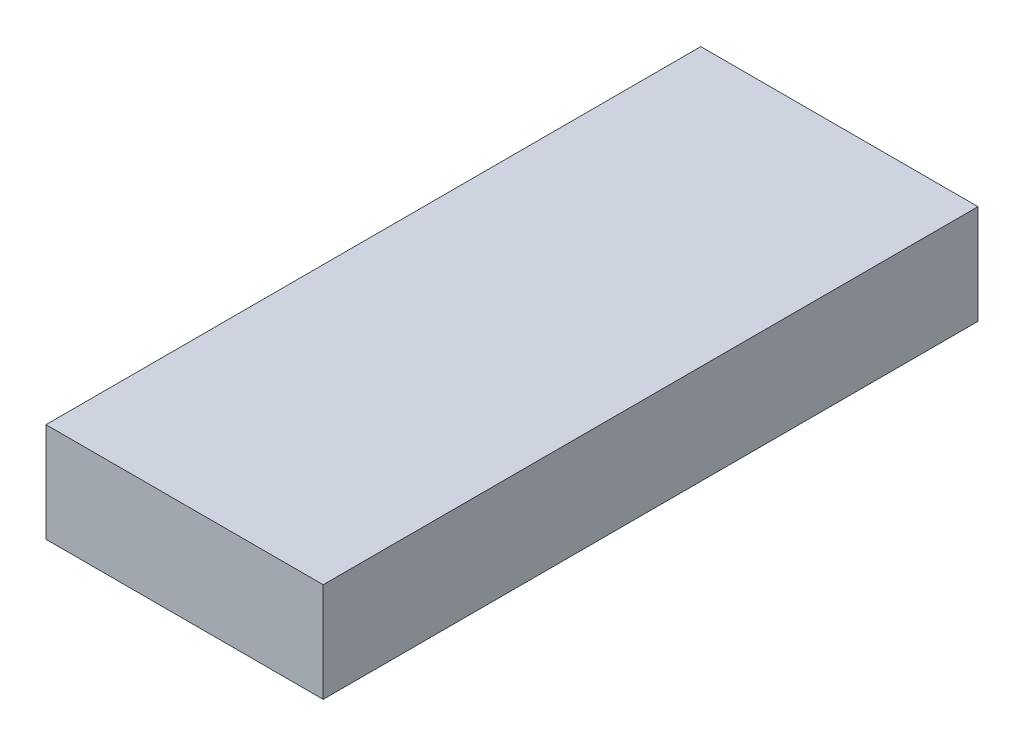
ISO-10303-21;
HEADER;
FILE_DESCRIPTION(('STEP AP214'),'2;1');
FILE_NAME('part.step','',(''),(''),'','','');
FILE_SCHEMA(('AUTOMOTIVE_DESIGN { 1 0 10303 214 1 1 1 1 }'));
ENDSEC;
DATA;
#1=APPLICATION_CONTEXT('core data for automotive mechanical design processes');
#2=APPLICATION_PROTOCOL_DEFINITION('international standard','automotive_design',2000,#1);
#3=PRODUCT_CONTEXT('',#1,'mechanical');
#4=PRODUCT('Part','Part','',(#3));
#5=PRODUCT_RELATED_PRODUCT_CATEGORY('part','',(#4));
#6=PRODUCT_DEFINITION_FORMATION('','',#4);
#7=PRODUCT_DEFINITION_CONTEXT('part definition',#1,'design');
#8=PRODUCT_DEFINITION('design','',#6,#7);
#9=PRODUCT_DEFINITION_SHAPE('','',#8);
#10=(LENGTH_UNIT() NAMED_UNIT(*) SI_UNIT(.MILLI.,.METRE.));
#11=(NAMED_UNIT(*) PLANE_ANGLE_UNIT() SI_UNIT($,.RADIAN.));
#12=(NAMED_UNIT(*) SI_UNIT($,.STERADIAN.) SOLID_ANGLE_UNIT());
#13=UNCERTAINTY_MEASURE_WITH_UNIT(LENGTH_MEASURE(1.E-05),#10,'distance_accuracy_value','');
#14=(GEOMETRIC_REPRESENTATION_CONTEXT(3) GLOBAL_UNCERTAINTY_ASSIGNED_CONTEXT((#13)) GLOBAL_UNIT_ASSIGNED_CONTEXT((#10,
#11,#12)) REPRESENTATION_CONTEXT('',''));
#15=CARTESIAN_POINT('',(0.,0.,0.));
#16=DIRECTION('',(0.,0.,1.));
#17=DIRECTION('',(1.,0.,0.));
#18=AXIS2_PLACEMENT_3D('',#15,#16,#17);
#19=CARTESIAN_POINT('',(0.508,-0.18199862,2.40000028));
#20=DIRECTION('',(0.,0.,-1.));
#21=DIRECTION('',(0.,-1.,0.));
#22=AXIS2_PLACEMENT_3D('',#19,#20,#21);
#23=PLANE('',#22);
#24=DIRECTION('',(0.,1.,0.));
#25=VECTOR('',#24,1.);
#26=CARTESIAN_POINT('',(0.508,-0.18199862,2.40000028));
#27=LINE('',#26,#25);
#28=CARTESIAN_POINT('',(0.508,-0.18199862,2.40000028));
#29=VERTEX_POINT('',#28);
#30=CARTESIAN_POINT('',(0.508,0.18200116,2.40000028));
#31=VERTEX_POINT('',#30);
#32=EDGE_CURVE('E89',#29,#31,#27,.T.);
#33=ORIENTED_EDGE('',*,*,#32,.T.);
#34=DIRECTION('',(-1.,0.,0.));
#35=VECTOR('',#34,1.);
#36=CARTESIAN_POINT('',(0.508,0.18200116,2.40000028));
#37=LINE('',#36,#35);
#38=CARTESIAN_POINT('',(-0.508,0.18200116,2.40000028));
#39=VERTEX_POINT('',#38);
#40=EDGE_CURVE('E84',#31,#39,#37,.T.);
#41=ORIENTED_EDGE('',*,*,#40,.T.);
#42=DIRECTION('',(0.,-1.,0.));
#43=VECTOR('',#42,1.);
#44=CARTESIAN_POINT('',(-0.508,0.18200116,2.40000028));
#45=LINE('',#44,#43);
#46=CARTESIAN_POINT('',(-0.508,-0.18199862,2.40000028));
#47=VERTEX_POINT('',#46);
#48=EDGE_CURVE('E100',#39,#47,#45,.T.);
#49=ORIENTED_EDGE('',*,*,#48,.T.);
#50=DIRECTION('',(1.,0.,0.));
#51=VECTOR('',#50,1.);
#52=CARTESIAN_POINT('',(-0.508,-0.18199862,2.40000028));
#53=LINE('',#52,#51);
#54=EDGE_CURVE('E11',#47,#29,#53,.T.);
#55=ORIENTED_EDGE('',*,*,#54,.T.);
#56=EDGE_LOOP('',(#33,#41,#49,#55));
#57=FACE_BOUND('',#56,.T.);
#58=ADVANCED_FACE('F16',(#57),#23,.F.);
#59=CARTESIAN_POINT('',(0.508,-0.18199862,0.));
#60=DIRECTION('',(0.,0.,-1.));
#61=DIRECTION('',(0.,-1.,0.));
#62=AXIS2_PLACEMENT_3D('',#59,#60,#61);
#63=PLANE('',#62);
#64=DIRECTION('',(1.,0.,0.));
#65=VECTOR('',#64,1.);
#66=CARTESIAN_POINT('',(-0.508,-0.18199862,0.));
#67=LINE('',#66,#65);
#68=CARTESIAN_POINT('',(-0.508,-0.18199862,0.));
#69=VERTEX_POINT('',#68);
#70=CARTESIAN_POINT('',(0.508,-0.18199862,0.));
#71=VERTEX_POINT('',#70);
#72=EDGE_CURVE('E20',#69,#71,#67,.T.);
#73=ORIENTED_EDGE('',*,*,#72,.F.);
#74=DIRECTION('',(0.,-1.,0.));
#75=VECTOR('',#74,1.);
#76=CARTESIAN_POINT('',(-0.508,0.18200116,0.));
#77=LINE('',#76,#75);
#78=CARTESIAN_POINT('',(-0.508,0.18200116,0.));
#79=VERTEX_POINT('',#78);
#80=EDGE_CURVE('E72',#79,#69,#77,.T.);
#81=ORIENTED_EDGE('',*,*,#80,.F.);
#82=DIRECTION('',(-1.,0.,0.));
#83=VECTOR('',#82,1.);
#84=CARTESIAN_POINT('',(0.508,0.18200116,0.));
#85=LINE('',#84,#83);
#86=CARTESIAN_POINT('',(0.508,0.18200116,0.));
#87=VERTEX_POINT('',#86);
#88=EDGE_CURVE('E66',#87,#79,#85,.T.);
#89=ORIENTED_EDGE('',*,*,#88,.F.);
#90=DIRECTION('',(0.,1.,0.));
#91=VECTOR('',#90,1.);
#92=CARTESIAN_POINT('',(0.508,-0.18199862,0.));
#93=LINE('',#92,#91);
#94=EDGE_CURVE('E70',#71,#87,#93,.T.);
#95=ORIENTED_EDGE('',*,*,#94,.F.);
#96=EDGE_LOOP('',(#73,#81,#89,#95));
#97=FACE_BOUND('',#96,.T.);
#98=ADVANCED_FACE('F68',(#97),#63,.T.);
#99=CARTESIAN_POINT('',(-0.508,-0.18199862,0.));
#100=DIRECTION('',(0.,1.,0.));
#101=DIRECTION('',(1.,0.,0.));
#102=AXIS2_PLACEMENT_3D('',#99,#100,#101);
#103=PLANE('',#102);
#104=ORIENTED_EDGE('',*,*,#72,.T.);
#105=DIRECTION('',(0.,0.,1.));
#106=VECTOR('',#105,1.);
#107=CARTESIAN_POINT('',(0.508,-0.18199862,0.));
#108=LINE('',#107,#106);
#109=EDGE_CURVE('E78',#71,#29,#108,.T.);
#110=ORIENTED_EDGE('',*,*,#109,.T.);
#111=ORIENTED_EDGE('',*,*,#54,.F.);
#112=DIRECTION('',(0.,0.,1.));
#113=VECTOR('',#112,1.);
#114=CARTESIAN_POINT('',(-0.508,-0.18199862,0.));
#115=LINE('',#114,#113);
#116=EDGE_CURVE('E109',#69,#47,#115,.T.);
#117=ORIENTED_EDGE('',*,*,#116,.F.);
#118=EDGE_LOOP('',(#104,#110,#111,#117));
#119=FACE_BOUND('',#118,.T.);
#120=ADVANCED_FACE('F115',(#119),#103,.F.);
#121=CARTESIAN_POINT('',(-0.508,0.18200116,0.));
#122=DIRECTION('',(1.,0.,0.));
#123=DIRECTION('',(0.,1.,0.));
#124=AXIS2_PLACEMENT_3D('',#121,#122,#123);
#125=PLANE('',#124);
#126=ORIENTED_EDGE('',*,*,#80,.T.);
#127=ORIENTED_EDGE('',*,*,#116,.T.);
#128=ORIENTED_EDGE('',*,*,#48,.F.);
#129=DIRECTION('',(0.,0.,1.));
#130=VECTOR('',#129,1.);
#131=CARTESIAN_POINT('',(-0.508,0.18200116,0.));
#132=LINE('',#131,#130);
#133=EDGE_CURVE('E77',#79,#39,#132,.T.);
#134=ORIENTED_EDGE('',*,*,#133,.F.);
#135=EDGE_LOOP('',(#126,#127,#128,#134));
#136=FACE_BOUND('',#135,.T.);
#137=ADVANCED_FACE('F18',(#136),#125,.F.);
#138=CARTESIAN_POINT('',(0.508,0.18200116,0.));
#139=DIRECTION('',(0.,-1.,0.));
#140=DIRECTION('',(0.,0.,-1.));
#141=AXIS2_PLACEMENT_3D('',#138,#139,#140);
#142=PLANE('',#141);
#143=ORIENTED_EDGE('',*,*,#88,.T.);
#144=ORIENTED_EDGE('',*,*,#133,.T.);
#145=ORIENTED_EDGE('',*,*,#40,.F.);
#146=DIRECTION('',(0.,0.,1.));
#147=VECTOR('',#146,1.);
#148=CARTESIAN_POINT('',(0.508,0.18200116,0.));
#149=LINE('',#148,#147);
#150=EDGE_CURVE('E81',#87,#31,#149,.T.);
#151=ORIENTED_EDGE('',*,*,#150,.F.);
#152=EDGE_LOOP('',(#143,#144,#145,#151));
#153=FACE_BOUND('',#152,.T.);
#154=ADVANCED_FACE('F82',(#153),#142,.F.);
#155=CARTESIAN_POINT('',(0.508,-0.18199862,0.));
#156=DIRECTION('',(-1.,0.,0.));
#157=DIRECTION('',(0.,0.,1.));
#158=AXIS2_PLACEMENT_3D('',#155,#156,#157);
#159=PLANE('',#158);
#160=ORIENTED_EDGE('',*,*,#94,.T.);
#161=ORIENTED_EDGE('',*,*,#150,.T.);
#162=ORIENTED_EDGE('',*,*,#32,.F.);
#163=ORIENTED_EDGE('',*,*,#109,.F.);
#164=EDGE_LOOP('',(#160,#161,#162,#163));
#165=FACE_BOUND('',#164,.T.);
#166=ADVANCED_FACE('F92',(#165),#159,.F.);
#167=CLOSED_SHELL('',(#58,#98,#120,#137,#154,#166));
#168=MANIFOLD_SOLID_BREP('B1',#167);
#169=ADVANCED_BREP_SHAPE_REPRESENTATION('',(#18,#168),#14);
#170=SHAPE_DEFINITION_REPRESENTATION(#9,#169);
ENDSEC;
END-ISO-10303-21;
